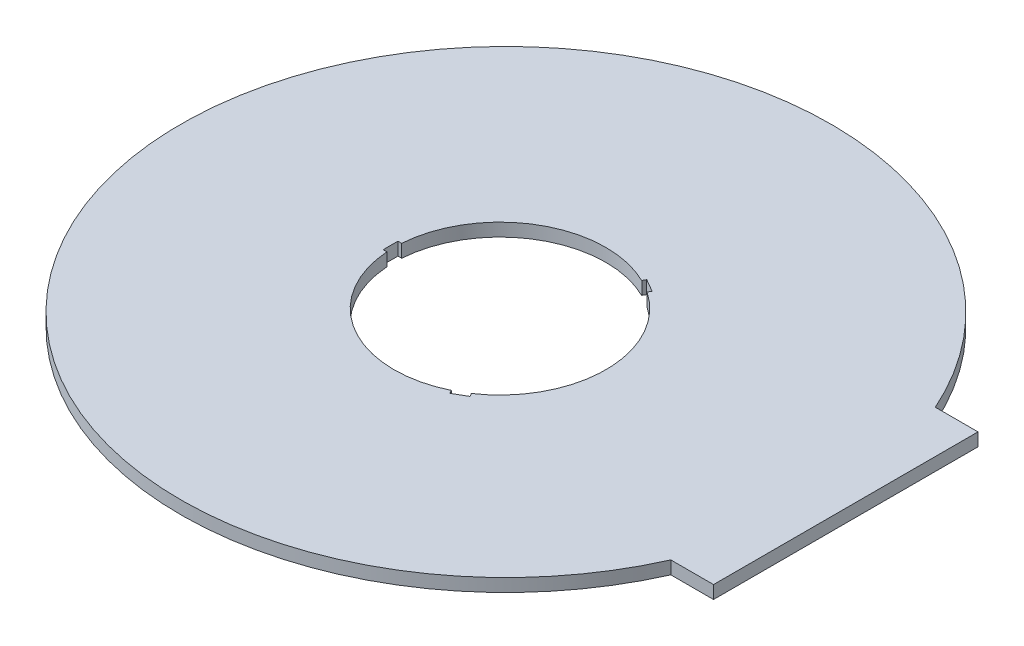
ISO-10303-21;
HEADER;
FILE_DESCRIPTION(('STEP AP214'),'2;1');
FILE_NAME('part.step','',(''),(''),'','','');
FILE_SCHEMA(('AUTOMOTIVE_DESIGN { 1 0 10303 214 1 1 1 1 }'));
ENDSEC;
DATA;
#1=APPLICATION_CONTEXT('core data for automotive mechanical design processes');
#2=APPLICATION_PROTOCOL_DEFINITION('international standard','automotive_design',2000,#1);
#3=PRODUCT_CONTEXT('',#1,'mechanical');
#4=PRODUCT('Part','Part','',(#3));
#5=PRODUCT_RELATED_PRODUCT_CATEGORY('part','',(#4));
#6=PRODUCT_DEFINITION_FORMATION('','',#4);
#7=PRODUCT_DEFINITION_CONTEXT('part definition',#1,'design');
#8=PRODUCT_DEFINITION('design','',#6,#7);
#9=PRODUCT_DEFINITION_SHAPE('','',#8);
#10=(LENGTH_UNIT() NAMED_UNIT(*) SI_UNIT(.MILLI.,.METRE.));
#11=(NAMED_UNIT(*) PLANE_ANGLE_UNIT() SI_UNIT($,.RADIAN.));
#12=(NAMED_UNIT(*) SI_UNIT($,.STERADIAN.) SOLID_ANGLE_UNIT());
#13=UNCERTAINTY_MEASURE_WITH_UNIT(LENGTH_MEASURE(1.E-05),#10,'distance_accuracy_value','');
#14=(GEOMETRIC_REPRESENTATION_CONTEXT(3) GLOBAL_UNCERTAINTY_ASSIGNED_CONTEXT((#13)) GLOBAL_UNIT_ASSIGNED_CONTEXT((#10,
#11,#12)) REPRESENTATION_CONTEXT('',''));
#15=CARTESIAN_POINT('',(0.,0.,0.));
#16=DIRECTION('',(0.,0.,1.));
#17=DIRECTION('',(1.,0.,0.));
#18=AXIS2_PLACEMENT_3D('',#15,#16,#17);
#19=CARTESIAN_POINT('',(-58.6230640228674,173.420204394958,-38.8984302868171));
#20=DIRECTION('',(1.,0.,0.));
#21=DIRECTION('',(0.,0.,-1.));
#22=AXIS2_PLACEMENT_3D('',#19,#20,#21);
#23=PLANE('',#22);
#24=DIRECTION('',(0.,0.,-1.));
#25=VECTOR('',#24,1.);
#26=CARTESIAN_POINT('',(-58.6230640228674,174.999,-38.8984302868171));
#27=LINE('',#26,#25);
#28=CARTESIAN_POINT('',(-58.6230640228674,174.999,-38.8984302868171));
#29=VERTEX_POINT('',#28);
#30=CARTESIAN_POINT('',(-58.6230640228673,174.999,-71.1015697131829));
#31=VERTEX_POINT('',#30);
#32=EDGE_CURVE('E266',#29,#31,#27,.T.);
#33=ORIENTED_EDGE('',*,*,#32,.F.);
#34=DIRECTION('',(0.,1.,0.));
#35=VECTOR('',#34,1.);
#36=CARTESIAN_POINT('',(-58.6230640228674,173.420204394958,-38.8984302868171));
#37=LINE('',#36,#35);
#38=CARTESIAN_POINT('',(-58.6230640228674,173.420204394958,-38.8984302868171));
#39=VERTEX_POINT('',#38);
#40=EDGE_CURVE('E35',#39,#29,#37,.T.);
#41=ORIENTED_EDGE('',*,*,#40,.F.);
#42=DIRECTION('',(0.,0.,-1.));
#43=VECTOR('',#42,1.);
#44=CARTESIAN_POINT('',(-58.6230640228674,173.420204394958,-38.8984302868171));
#45=LINE('',#44,#43);
#46=CARTESIAN_POINT('',(-58.6230640228673,173.420204394958,-71.1015697131829));
#47=VERTEX_POINT('',#46);
#48=EDGE_CURVE('E335',#39,#47,#45,.T.);
#49=ORIENTED_EDGE('',*,*,#48,.T.);
#50=DIRECTION('',(0.,1.,0.));
#51=VECTOR('',#50,1.);
#52=CARTESIAN_POINT('',(-58.6230640228673,173.420204394958,-71.1015697131829));
#53=LINE('',#52,#51);
#54=EDGE_CURVE('E10',#47,#31,#53,.T.);
#55=ORIENTED_EDGE('',*,*,#54,.T.);
#56=EDGE_LOOP('',(#33,#41,#49,#55));
#57=FACE_BOUND('',#56,.T.);
#58=ADVANCED_FACE('F16',(#57),#23,.T.);
#59=CARTESIAN_POINT('',(-58.6230640228673,173.420204394958,-71.1015697131829));
#60=DIRECTION('',(0.,0.,-1.));
#61=DIRECTION('',(-1.,0.,0.));
#62=AXIS2_PLACEMENT_3D('',#59,#60,#61);
#63=PLANE('',#62);
#64=DIRECTION('',(-1.,0.,0.));
#65=VECTOR('',#64,1.);
#66=CARTESIAN_POINT('',(-58.6230640228673,174.999,-71.1015697131829));
#67=LINE('',#66,#65);
#68=CARTESIAN_POINT('',(-63.8122010916743,174.999,-71.1015697131829));
#69=VERTEX_POINT('',#68);
#70=EDGE_CURVE('E269',#31,#69,#67,.T.);
#71=ORIENTED_EDGE('',*,*,#70,.F.);
#72=ORIENTED_EDGE('',*,*,#54,.F.);
#73=DIRECTION('',(-1.,0.,0.));
#74=VECTOR('',#73,1.);
#75=CARTESIAN_POINT('',(-58.6230640228673,173.420204394958,-71.1015697131829));
#76=LINE('',#75,#74);
#77=CARTESIAN_POINT('',(-63.8122010916743,173.420204394958,-71.1015697131829));
#78=VERTEX_POINT('',#77);
#79=EDGE_CURVE('E387',#47,#78,#76,.T.);
#80=ORIENTED_EDGE('',*,*,#79,.T.);
#81=DIRECTION('',(0.,1.,0.));
#82=VECTOR('',#81,1.);
#83=CARTESIAN_POINT('',(-63.8122010916743,173.420204394958,-71.1015697131829));
#84=LINE('',#83,#82);
#85=EDGE_CURVE('E26',#78,#69,#84,.T.);
#86=ORIENTED_EDGE('',*,*,#85,.T.);
#87=EDGE_LOOP('',(#71,#72,#80,#86));
#88=FACE_BOUND('',#87,.T.);
#89=ADVANCED_FACE('F395',(#88),#63,.T.);
#90=CARTESIAN_POINT('',(-64.5422786970172,173.420204394958,-70.));
#91=DIRECTION('',(-0.833549755446666,0.,-0.552444391042938));
#92=DIRECTION('',(-0.552444391042939,0.,0.833549755446666));
#93=AXIS2_PLACEMENT_3D('',#90,#91,#92);
#94=PLANE('',#93);
#95=DIRECTION('',(-0.552444391042939,0.,0.833549755446666));
#96=VECTOR('',#95,1.);
#97=CARTESIAN_POINT('',(-64.5422786970172,174.999,-70.));
#98=LINE('',#97,#96);
#99=CARTESIAN_POINT('',(-63.816607962522,174.999,-71.0949204536792));
#100=VERTEX_POINT('',#99);
#101=EDGE_CURVE('E272',#69,#100,#98,.T.);
#102=ORIENTED_EDGE('',*,*,#101,.F.);
#103=ORIENTED_EDGE('',*,*,#85,.F.);
#104=DIRECTION('',(-0.552444391042939,0.,0.833549755446666));
#105=VECTOR('',#104,1.);
#106=CARTESIAN_POINT('',(-64.5422786970172,173.420204394958,-70.));
#107=LINE('',#106,#105);
#108=CARTESIAN_POINT('',(-63.816607962522,173.420204394958,-71.0949204536792));
#109=VERTEX_POINT('',#108);
#110=EDGE_CURVE('E202',#78,#109,#107,.T.);
#111=ORIENTED_EDGE('',*,*,#110,.T.);
#112=DIRECTION('',(0.,1.,0.));
#113=VECTOR('',#112,1.);
#114=CARTESIAN_POINT('',(-63.816607962522,173.420204394958,-71.0949204536792));
#115=LINE('',#114,#113);
#116=EDGE_CURVE('E194',#109,#100,#115,.T.);
#117=ORIENTED_EDGE('',*,*,#116,.T.);
#118=EDGE_LOOP('',(#102,#103,#111,#117));
#119=FACE_BOUND('',#118,.T.);
#120=ADVANCED_FACE('F391',(#119),#94,.T.);
#121=CARTESIAN_POINT('',(-100.,173.420204394958,-55.));
#122=DIRECTION('',(0.,1.,0.));
#123=DIRECTION('',(0.,0.,1.));
#124=AXIS2_PLACEMENT_3D('',#121,#122,#123);
#125=CYLINDRICAL_SURFACE('',#124,39.6015697131829);
#126=CARTESIAN_POINT('',(-100.,174.999,-55.));
#127=DIRECTION('',(0.,1.,0.));
#128=DIRECTION('',(0.913685803354228,0.,-0.406421274970861));
#129=AXIS2_PLACEMENT_3D('',#126,#127,#128);
#130=CIRCLE('',#129,39.6015697131829);
#131=CARTESIAN_POINT('',(-63.816607962522,174.999,-38.9050795463208));
#132=VERTEX_POINT('',#131);
#133=EDGE_CURVE('E275',#100,#132,#130,.T.);
#134=ORIENTED_EDGE('',*,*,#133,.F.);
#135=ORIENTED_EDGE('',*,*,#116,.F.);
#136=CARTESIAN_POINT('',(-100.,173.420204394958,-55.));
#137=DIRECTION('',(0.,1.,0.));
#138=DIRECTION('',(0.913685803354228,0.,-0.406421274970861));
#139=AXIS2_PLACEMENT_3D('',#136,#137,#138);
#140=CIRCLE('',#139,39.6015697131829);
#141=CARTESIAN_POINT('',(-63.816607962522,173.420204394958,-38.9050795463208));
#142=VERTEX_POINT('',#141);
#143=EDGE_CURVE('E197',#109,#142,#140,.T.);
#144=ORIENTED_EDGE('',*,*,#143,.T.);
#145=DIRECTION('',(0.,1.,0.));
#146=VECTOR('',#145,1.);
#147=CARTESIAN_POINT('',(-63.816607962522,173.420204394958,-38.9050795463208));
#148=LINE('',#147,#146);
#149=EDGE_CURVE('E183',#142,#132,#148,.T.);
#150=ORIENTED_EDGE('',*,*,#149,.T.);
#151=EDGE_LOOP('',(#134,#135,#144,#150));
#152=FACE_BOUND('',#151,.T.);
#153=ADVANCED_FACE('F198',(#152),#125,.T.);
#154=CARTESIAN_POINT('',(-63.8122010916742,173.420204394958,-38.8984302868171));
#155=DIRECTION('',(-0.833549755446656,0.,0.552444391042953));
#156=DIRECTION('',(0.552444391042953,0.,0.833549755446656));
#157=AXIS2_PLACEMENT_3D('',#154,#155,#156);
#158=PLANE('',#157);
#159=DIRECTION('',(0.552444391042953,0.,0.833549755446656));
#160=VECTOR('',#159,1.);
#161=CARTESIAN_POINT('',(-63.8122010916742,174.999,-38.8984302868171));
#162=LINE('',#161,#160);
#163=CARTESIAN_POINT('',(-63.8122010916742,174.999,-38.8984302868171));
#164=VERTEX_POINT('',#163);
#165=EDGE_CURVE('E190',#132,#164,#162,.T.);
#166=ORIENTED_EDGE('',*,*,#165,.F.);
#167=ORIENTED_EDGE('',*,*,#149,.F.);
#168=DIRECTION('',(0.552444391042953,0.,0.833549755446656));
#169=VECTOR('',#168,1.);
#170=CARTESIAN_POINT('',(-63.8122010916742,173.420204394958,-38.8984302868171));
#171=LINE('',#170,#169);
#172=CARTESIAN_POINT('',(-63.8122010916742,173.420204394958,-38.8984302868171));
#173=VERTEX_POINT('',#172);
#174=EDGE_CURVE('E187',#142,#173,#171,.T.);
#175=ORIENTED_EDGE('',*,*,#174,.T.);
#176=DIRECTION('',(0.,1.,0.));
#177=VECTOR('',#176,1.);
#178=CARTESIAN_POINT('',(-63.8122010916742,173.420204394958,-38.8984302868171));
#179=LINE('',#178,#177);
#180=EDGE_CURVE('E111',#173,#164,#179,.T.);
#181=ORIENTED_EDGE('',*,*,#180,.T.);
#182=EDGE_LOOP('',(#166,#167,#175,#181));
#183=FACE_BOUND('',#182,.T.);
#184=ADVANCED_FACE('F185',(#183),#158,.T.);
#185=CARTESIAN_POINT('',(-92.0643796982059,173.420204394958,-43.9999999999989));
#186=DIRECTION('',(-0.188982236504612,0.,0.981980506061966));
#187=DIRECTION('',(0.981980506061966,0.,0.188982236504612));
#188=AXIS2_PLACEMENT_3D('',#185,#186,#187);
#189=PLANE('',#188);
#190=DIRECTION('',(0.981980506061966,0.,0.188982236504612));
#191=VECTOR('',#190,1.);
#192=CARTESIAN_POINT('',(-92.0643796982059,174.999,-43.9999999999989));
#193=LINE('',#192,#191);
#194=CARTESIAN_POINT('',(-93.5444605861132,174.999,-44.2848416996841));
#195=VERTEX_POINT('',#194);
#196=CARTESIAN_POINT('',(-93.4953607316899,174.999,-44.2753924282946));
#197=VERTEX_POINT('',#196);
#198=EDGE_CURVE('E212',#195,#197,#193,.T.);
#199=ORIENTED_EDGE('',*,*,#198,.F.);
#200=DIRECTION('',(0.,1.,0.));
#201=VECTOR('',#200,1.);
#202=CARTESIAN_POINT('',(-93.5444605861132,173.420204394958,-44.2848416996841));
#203=LINE('',#202,#201);
#204=CARTESIAN_POINT('',(-93.5444605861132,173.420204394958,-44.2848416996841));
#205=VERTEX_POINT('',#204);
#206=EDGE_CURVE('E208',#205,#195,#203,.T.);
#207=ORIENTED_EDGE('',*,*,#206,.F.);
#208=DIRECTION('',(0.981980506061966,0.,0.188982236504612));
#209=VECTOR('',#208,1.);
#210=CARTESIAN_POINT('',(-92.0643796982059,173.420204394958,-43.9999999999989));
#211=LINE('',#210,#209);
#212=CARTESIAN_POINT('',(-93.4953607316899,173.420204394958,-44.2753924282946));
#213=VERTEX_POINT('',#212);
#214=EDGE_CURVE('E280',#205,#213,#211,.T.);
#215=ORIENTED_EDGE('',*,*,#214,.T.);
#216=DIRECTION('',(0.,1.,0.));
#217=VECTOR('',#216,1.);
#218=CARTESIAN_POINT('',(-93.4953607316899,173.420204394958,-44.2753924282946));
#219=LINE('',#218,#217);
#220=EDGE_CURVE('E20',#213,#197,#219,.T.);
#221=ORIENTED_EDGE('',*,*,#220,.T.);
#222=EDGE_LOOP('',(#199,#207,#215,#221));
#223=FACE_BOUND('',#222,.T.);
#224=ADVANCED_FACE('F18',(#223),#189,.T.);
#225=CARTESIAN_POINT('',(-93.4953607316899,173.420204394958,-44.2753924282946));
#226=DIRECTION('',(-0.866025403784436,0.,0.500000000000004));
#227=DIRECTION('',(0.500000000000004,0.,0.866025403784436));
#228=AXIS2_PLACEMENT_3D('',#225,#226,#227);
#229=PLANE('',#228);
#230=DIRECTION('',(0.500000000000004,0.,0.866025403784436));
#231=VECTOR('',#230,1.);
#232=CARTESIAN_POINT('',(-93.4953607316899,174.999,-44.2753924282946));
#233=LINE('',#232,#231);
#234=CARTESIAN_POINT('',(-93.2855726407283,174.999,-43.9120287959264));
#235=VERTEX_POINT('',#234);
#236=EDGE_CURVE('E215',#197,#235,#233,.T.);
#237=ORIENTED_EDGE('',*,*,#236,.F.);
#238=ORIENTED_EDGE('',*,*,#220,.F.);
#239=DIRECTION('',(0.500000000000004,0.,0.866025403784436));
#240=VECTOR('',#239,1.);
#241=CARTESIAN_POINT('',(-93.4953607316899,173.420204394958,-44.2753924282946));
#242=LINE('',#241,#240);
#243=CARTESIAN_POINT('',(-93.2855726407283,173.420204394958,-43.9120287959264));
#244=VERTEX_POINT('',#243);
#245=EDGE_CURVE('E339',#213,#244,#242,.T.);
#246=ORIENTED_EDGE('',*,*,#245,.T.);
#247=DIRECTION('',(0.,1.,0.));
#248=VECTOR('',#247,1.);
#249=CARTESIAN_POINT('',(-93.2855726407283,173.420204394958,-43.9120287959264));
#250=LINE('',#249,#248);
#251=EDGE_CURVE('E315',#244,#235,#250,.T.);
#252=ORIENTED_EDGE('',*,*,#251,.T.);
#253=EDGE_LOOP('',(#237,#238,#246,#252));
#254=FACE_BOUND('',#253,.T.);
#255=ADVANCED_FACE('F321',(#254),#229,.T.);
#256=CARTESIAN_POINT('',(-93.2855726407283,173.420204394958,-43.9120287959264));
#257=DIRECTION('',(-0.499999999999994,0.,-0.866025403784442));
#258=DIRECTION('',(-0.866025403784442,0.,0.499999999999994));
#259=AXIS2_PLACEMENT_3D('',#256,#257,#258);
#260=PLANE('',#259);
#261=DIRECTION('',(-0.866025403784442,0.,0.499999999999994));
#262=VECTOR('',#261,1.);
#263=CARTESIAN_POINT('',(-93.2855726407283,174.999,-43.9120287959264));
#264=LINE('',#263,#262);
#265=CARTESIAN_POINT('',(-94.8416995445542,174.999,-43.0135985091093));
#266=VERTEX_POINT('',#265);
#267=EDGE_CURVE('E218',#235,#266,#264,.T.);
#268=ORIENTED_EDGE('',*,*,#267,.F.);
#269=ORIENTED_EDGE('',*,*,#251,.F.);
#270=DIRECTION('',(-0.866025403784442,0.,0.499999999999994));
#271=VECTOR('',#270,1.);
#272=CARTESIAN_POINT('',(-93.2855726407283,173.420204394958,-43.9120287959264));
#273=LINE('',#272,#271);
#274=CARTESIAN_POINT('',(-94.8416995445542,173.420204394958,-43.0135985091093));
#275=VERTEX_POINT('',#274);
#276=EDGE_CURVE('E341',#244,#275,#273,.T.);
#277=ORIENTED_EDGE('',*,*,#276,.T.);
#278=DIRECTION('',(0.,1.,0.));
#279=VECTOR('',#278,1.);
#280=CARTESIAN_POINT('',(-94.8416995445542,173.420204394958,-43.0135985091093));
#281=LINE('',#280,#279);
#282=EDGE_CURVE('E314',#275,#266,#281,.T.);
#283=ORIENTED_EDGE('',*,*,#282,.T.);
#284=EDGE_LOOP('',(#268,#269,#277,#283));
#285=FACE_BOUND('',#284,.T.);
#286=ADVANCED_FACE('F471',(#285),#260,.T.);
#287=CARTESIAN_POINT('',(-94.8416995445542,173.420204394958,-43.0135985091093));
#288=DIRECTION('',(0.866025403784436,0.,-0.500000000000004));
#289=DIRECTION('',(-0.500000000000004,0.,-0.866025403784436));
#290=AXIS2_PLACEMENT_3D('',#287,#288,#289);
#291=PLANE('',#290);
#292=DIRECTION('',(-0.500000000000004,0.,-0.866025403784436));
#293=VECTOR('',#292,1.);
#294=CARTESIAN_POINT('',(-94.8416995445542,174.999,-43.0135985091093));
#295=LINE('',#294,#293);
#296=CARTESIAN_POINT('',(-95.0514876355157,174.999,-43.3769621414775));
#297=VERTEX_POINT('',#296);
#298=EDGE_CURVE('E221',#266,#297,#295,.T.);
#299=ORIENTED_EDGE('',*,*,#298,.F.);
#300=ORIENTED_EDGE('',*,*,#282,.F.);
#301=DIRECTION('',(-0.500000000000004,0.,-0.866025403784436));
#302=VECTOR('',#301,1.);
#303=CARTESIAN_POINT('',(-94.8416995445542,173.420204394958,-43.0135985091093));
#304=LINE('',#303,#302);
#305=CARTESIAN_POINT('',(-95.0514876355157,173.420204394958,-43.3769621414775));
#306=VERTEX_POINT('',#305);
#307=EDGE_CURVE('E346',#275,#306,#304,.T.);
#308=ORIENTED_EDGE('',*,*,#307,.T.);
#309=DIRECTION('',(0.,1.,0.));
#310=VECTOR('',#309,1.);
#311=CARTESIAN_POINT('',(-95.0514876355157,173.420204394958,-43.3769621414775));
#312=LINE('',#311,#310);
#313=EDGE_CURVE('E312',#306,#297,#312,.T.);
#314=ORIENTED_EDGE('',*,*,#313,.T.);
#315=EDGE_LOOP('',(#299,#300,#308,#314));
#316=FACE_BOUND('',#315,.T.);
#317=ADVANCED_FACE('F467',(#316),#291,.T.);
#318=CARTESIAN_POINT('',(-95.5284813133437,173.420204394958,-41.9999999999989));
#319=DIRECTION('',(0.944911182523069,0.,0.327326835353987));
#320=DIRECTION('',(0.327326835353987,0.,-0.944911182523069));
#321=AXIS2_PLACEMENT_3D('',#318,#319,#320);
#322=PLANE('',#321);
#323=DIRECTION('',(0.327326835353987,0.,-0.944911182523068));
#324=VECTOR('',#323,1.);
#325=CARTESIAN_POINT('',(-95.5284813133437,174.999,-41.9999999999989));
#326=LINE('',#325,#324);
#327=CARTESIAN_POINT('',(-95.0351210173746,174.999,-43.424208498425));
#328=VERTEX_POINT('',#327);
#329=EDGE_CURVE('E224',#297,#328,#326,.T.);
#330=ORIENTED_EDGE('',*,*,#329,.F.);
#331=ORIENTED_EDGE('',*,*,#313,.F.);
#332=DIRECTION('',(0.327326835353987,0.,-0.944911182523068));
#333=VECTOR('',#332,1.);
#334=CARTESIAN_POINT('',(-95.5284813133437,173.420204394958,-41.9999999999989));
#335=LINE('',#334,#333);
#336=CARTESIAN_POINT('',(-95.0351210173746,173.420204394958,-43.424208498425));
#337=VERTEX_POINT('',#336);
#338=EDGE_CURVE('E349',#306,#337,#335,.T.);
#339=ORIENTED_EDGE('',*,*,#338,.T.);
#340=DIRECTION('',(0.,1.,0.));
#341=VECTOR('',#340,1.);
#342=CARTESIAN_POINT('',(-95.0351210173746,173.420204394958,-43.424208498425));
#343=LINE('',#342,#341);
#344=EDGE_CURVE('E310',#337,#328,#343,.T.);
#345=ORIENTED_EDGE('',*,*,#344,.T.);
#346=EDGE_LOOP('',(#330,#331,#339,#345));
#347=FACE_BOUND('',#346,.T.);
#348=ADVANCED_FACE('F463',(#347),#322,.T.);
#349=CARTESIAN_POINT('',(-100.72463373605,173.420204394958,-54.9999999999988));
#350=DIRECTION('',(0.,1.,0.));
#351=DIRECTION('',(0.,0.,1.));
#352=AXIS2_PLACEMENT_3D('',#349,#350,#351);
#353=CYLINDRICAL_SURFACE('',#352,12.8984302868171);
#354=CARTESIAN_POINT('',(-100.72463373605,174.999,-54.9999999999988));
#355=DIRECTION('',(0.,-1.,0.));
#356=DIRECTION('',(0.441101172170597,0.,0.897457383896152));
#357=AXIS2_PLACEMENT_3D('',#354,#355,#356);
#358=CIRCLE('',#357,12.8984302868171);
#359=CARTESIAN_POINT('',(-113.594319604663,174.999,-54.1393667987398));
#360=VERTEX_POINT('',#359);
#361=EDGE_CURVE('E227',#328,#360,#358,.T.);
#362=ORIENTED_EDGE('',*,*,#361,.F.);
#363=ORIENTED_EDGE('',*,*,#344,.F.);
#364=CARTESIAN_POINT('',(-100.72463373605,173.420204394958,-54.9999999999988));
#365=DIRECTION('',(0.,-1.,0.));
#366=DIRECTION('',(0.441101172170597,0.,0.897457383896152));
#367=AXIS2_PLACEMENT_3D('',#364,#365,#366);
#368=CIRCLE('',#367,12.8984302868171);
#369=CARTESIAN_POINT('',(-113.594319604663,173.420204394958,-54.1393667987398));
#370=VERTEX_POINT('',#369);
#371=EDGE_CURVE('E352',#337,#370,#368,.T.);
#372=ORIENTED_EDGE('',*,*,#371,.T.);
#373=DIRECTION('',(0.,1.,0.));
#374=VECTOR('',#373,1.);
#375=CARTESIAN_POINT('',(-113.594319604663,173.420204394958,-54.1393667987398));
#376=LINE('',#375,#374);
#377=EDGE_CURVE('E308',#370,#360,#376,.T.);
#378=ORIENTED_EDGE('',*,*,#377,.T.);
#379=EDGE_LOOP('',(#362,#363,#372,#378));
#380=FACE_BOUND('',#379,.T.);
#381=ADVANCED_FACE('F459',(#380),#353,.F.);
#382=CARTESIAN_POINT('',(-114.581040196601,173.420204394958,-52.9999999999988));
#383=DIRECTION('',(-0.755928946018453,0.,-0.654653670707979));
#384=DIRECTION('',(-0.654653670707979,0.,0.755928946018453));
#385=AXIS2_PLACEMENT_3D('',#382,#383,#384);
#386=PLANE('',#385);
#387=DIRECTION('',(-0.654653670707979,0.,0.755928946018453));
#388=VECTOR('',#387,1.);
#389=CARTESIAN_POINT('',(-114.581040196601,174.999,-52.9999999999988));
#390=LINE('',#389,#388);
#391=CARTESIAN_POINT('',(-113.627052840945,174.999,-54.1015697131817));
#392=VERTEX_POINT('',#391);
#393=EDGE_CURVE('E230',#360,#392,#390,.T.);
#394=ORIENTED_EDGE('',*,*,#393,.F.);
#395=ORIENTED_EDGE('',*,*,#377,.F.);
#396=DIRECTION('',(-0.654653670707979,0.,0.755928946018453));
#397=VECTOR('',#396,1.);
#398=CARTESIAN_POINT('',(-114.581040196601,173.420204394958,-52.9999999999988));
#399=LINE('',#398,#397);
#400=CARTESIAN_POINT('',(-113.627052840945,173.420204394958,-54.1015697131817));
#401=VERTEX_POINT('',#400);
#402=EDGE_CURVE('E355',#370,#401,#399,.T.);
#403=ORIENTED_EDGE('',*,*,#402,.T.);
#404=DIRECTION('',(0.,1.,0.));
#405=VECTOR('',#404,1.);
#406=CARTESIAN_POINT('',(-113.627052840945,173.420204394958,-54.1015697131817));
#407=LINE('',#406,#405);
#408=EDGE_CURVE('E306',#401,#392,#407,.T.);
#409=ORIENTED_EDGE('',*,*,#408,.T.);
#410=EDGE_LOOP('',(#394,#395,#403,#409));
#411=FACE_BOUND('',#410,.T.);
#412=ADVANCED_FACE('F455',(#411),#386,.T.);
#413=CARTESIAN_POINT('',(-113.627052840945,173.420204394958,-54.1015697131817));
#414=DIRECTION('',(0.,0.,-1.));
#415=DIRECTION('',(-1.,0.,0.));
#416=AXIS2_PLACEMENT_3D('',#413,#414,#415);
#417=PLANE('',#416);
#418=DIRECTION('',(-1.,0.,0.));
#419=VECTOR('',#418,1.);
#420=CARTESIAN_POINT('',(-113.627052840945,174.999,-54.1015697131817));
#421=LINE('',#420,#419);
#422=CARTESIAN_POINT('',(-114.046629022869,174.999,-54.1015697131817));
#423=VERTEX_POINT('',#422);
#424=EDGE_CURVE('E233',#392,#423,#421,.T.);
#425=ORIENTED_EDGE('',*,*,#424,.F.);
#426=ORIENTED_EDGE('',*,*,#408,.F.);
#427=DIRECTION('',(-1.,0.,0.));
#428=VECTOR('',#427,1.);
#429=CARTESIAN_POINT('',(-113.627052840945,173.420204394958,-54.1015697131817));
#430=LINE('',#429,#428);
#431=CARTESIAN_POINT('',(-114.046629022869,173.420204394958,-54.1015697131817));
#432=VERTEX_POINT('',#431);
#433=EDGE_CURVE('E358',#401,#432,#430,.T.);
#434=ORIENTED_EDGE('',*,*,#433,.T.);
#435=DIRECTION('',(0.,1.,0.));
#436=VECTOR('',#435,1.);
#437=CARTESIAN_POINT('',(-114.046629022869,173.420204394958,-54.1015697131817));
#438=LINE('',#437,#436);
#439=EDGE_CURVE('E304',#432,#423,#438,.T.);
#440=ORIENTED_EDGE('',*,*,#439,.T.);
#441=EDGE_LOOP('',(#425,#426,#434,#440));
#442=FACE_BOUND('',#441,.T.);
#443=ADVANCED_FACE('F451',(#442),#417,.T.);
#444=CARTESIAN_POINT('',(-114.046629022869,173.420204394958,-54.1015697131817));
#445=DIRECTION('',(1.,0.,0.));
#446=DIRECTION('',(0.,0.,-1.));
#447=AXIS2_PLACEMENT_3D('',#444,#445,#446);
#448=PLANE('',#447);
#449=DIRECTION('',(0.,0.,-1.));
#450=VECTOR('',#449,1.);
#451=CARTESIAN_POINT('',(-114.046629022869,174.999,-54.1015697131817));
#452=LINE('',#451,#450);
#453=CARTESIAN_POINT('',(-114.046629022869,174.999,-55.8984302868158));
#454=VERTEX_POINT('',#453);
#455=EDGE_CURVE('E236',#423,#454,#452,.T.);
#456=ORIENTED_EDGE('',*,*,#455,.F.);
#457=ORIENTED_EDGE('',*,*,#439,.F.);
#458=DIRECTION('',(0.,0.,-1.));
#459=VECTOR('',#458,1.);
#460=CARTESIAN_POINT('',(-114.046629022869,173.420204394958,-54.1015697131817));
#461=LINE('',#460,#459);
#462=CARTESIAN_POINT('',(-114.046629022869,173.420204394958,-55.8984302868158));
#463=VERTEX_POINT('',#462);
#464=EDGE_CURVE('E361',#432,#463,#461,.T.);
#465=ORIENTED_EDGE('',*,*,#464,.T.);
#466=DIRECTION('',(0.,1.,0.));
#467=VECTOR('',#466,1.);
#468=CARTESIAN_POINT('',(-114.046629022869,173.420204394958,-55.8984302868158));
#469=LINE('',#468,#467);
#470=EDGE_CURVE('E302',#463,#454,#469,.T.);
#471=ORIENTED_EDGE('',*,*,#470,.T.);
#472=EDGE_LOOP('',(#456,#457,#465,#471));
#473=FACE_BOUND('',#472,.T.);
#474=ADVANCED_FACE('F447',(#473),#448,.T.);
#475=CARTESIAN_POINT('',(-114.046629022869,173.420204394958,-55.8984302868158));
#476=DIRECTION('',(0.,0.,1.));
#477=DIRECTION('',(1.,0.,0.));
#478=AXIS2_PLACEMENT_3D('',#475,#476,#477);
#479=PLANE('',#478);
#480=DIRECTION('',(1.,0.,0.));
#481=VECTOR('',#480,1.);
#482=CARTESIAN_POINT('',(-114.046629022869,174.999,-55.8984302868158));
#483=LINE('',#482,#481);
#484=CARTESIAN_POINT('',(-113.627052840945,174.999,-55.8984302868158));
#485=VERTEX_POINT('',#484);
#486=EDGE_CURVE('E239',#454,#485,#483,.T.);
#487=ORIENTED_EDGE('',*,*,#486,.F.);
#488=ORIENTED_EDGE('',*,*,#470,.F.);
#489=DIRECTION('',(1.,0.,0.));
#490=VECTOR('',#489,1.);
#491=CARTESIAN_POINT('',(-114.046629022869,173.420204394958,-55.8984302868158));
#492=LINE('',#491,#490);
#493=CARTESIAN_POINT('',(-113.627052840945,173.420204394958,-55.8984302868158));
#494=VERTEX_POINT('',#493);
#495=EDGE_CURVE('E364',#463,#494,#492,.T.);
#496=ORIENTED_EDGE('',*,*,#495,.T.);
#497=DIRECTION('',(0.,1.,0.));
#498=VECTOR('',#497,1.);
#499=CARTESIAN_POINT('',(-113.627052840945,173.420204394958,-55.8984302868158));
#500=LINE('',#499,#498);
#501=EDGE_CURVE('E300',#494,#485,#500,.T.);
#502=ORIENTED_EDGE('',*,*,#501,.T.);
#503=EDGE_LOOP('',(#487,#488,#496,#502));
#504=FACE_BOUND('',#503,.T.);
#505=ADVANCED_FACE('F443',(#504),#479,.T.);
#506=CARTESIAN_POINT('',(-114.581040196601,173.420204394958,-56.9999999999988));
#507=DIRECTION('',(-0.755928946018455,0.,0.654653670707977));
#508=DIRECTION('',(0.654653670707977,0.,0.755928946018455));
#509=AXIS2_PLACEMENT_3D('',#506,#507,#508);
#510=PLANE('',#509);
#511=DIRECTION('',(0.654653670707977,0.,0.755928946018455));
#512=VECTOR('',#511,1.);
#513=CARTESIAN_POINT('',(-114.581040196601,174.999,-56.9999999999988));
#514=LINE('',#513,#512);
#515=CARTESIAN_POINT('',(-113.594319604663,174.999,-55.8606332012577));
#516=VERTEX_POINT('',#515);
#517=EDGE_CURVE('E242',#485,#516,#514,.T.);
#518=ORIENTED_EDGE('',*,*,#517,.F.);
#519=ORIENTED_EDGE('',*,*,#501,.F.);
#520=DIRECTION('',(0.654653670707977,0.,0.755928946018455));
#521=VECTOR('',#520,1.);
#522=CARTESIAN_POINT('',(-114.581040196601,173.420204394958,-56.9999999999988));
#523=LINE('',#522,#521);
#524=CARTESIAN_POINT('',(-113.594319604663,173.420204394958,-55.8606332012577));
#525=VERTEX_POINT('',#524);
#526=EDGE_CURVE('E367',#494,#525,#523,.T.);
#527=ORIENTED_EDGE('',*,*,#526,.T.);
#528=DIRECTION('',(0.,1.,0.));
#529=VECTOR('',#528,1.);
#530=CARTESIAN_POINT('',(-113.594319604663,173.420204394958,-55.8606332012577));
#531=LINE('',#530,#529);
#532=EDGE_CURVE('E298',#525,#516,#531,.T.);
#533=ORIENTED_EDGE('',*,*,#532,.T.);
#534=EDGE_LOOP('',(#518,#519,#527,#533));
#535=FACE_BOUND('',#534,.T.);
#536=ADVANCED_FACE('F439',(#535),#510,.T.);
#537=CARTESIAN_POINT('',(-100.72463373605,173.420204394958,-54.9999999999988));
#538=DIRECTION('',(0.,1.,0.));
#539=DIRECTION('',(0.,0.,1.));
#540=AXIS2_PLACEMENT_3D('',#537,#538,#539);
#541=CYLINDRICAL_SURFACE('',#540,12.8984302868171);
#542=CARTESIAN_POINT('',(-100.72463373605,174.999,-54.9999999999988));
#543=DIRECTION('',(0.,-1.,0.));
#544=DIRECTION('',(-0.99777147935329,0.,-0.066723871209242));
#545=AXIS2_PLACEMENT_3D('',#542,#543,#544);
#546=CIRCLE('',#545,12.8984302868171);
#547=CARTESIAN_POINT('',(-95.0351210173746,174.999,-66.5757915015725));
#548=VERTEX_POINT('',#547);
#549=EDGE_CURVE('E245',#516,#548,#546,.T.);
#550=ORIENTED_EDGE('',*,*,#549,.F.);
#551=ORIENTED_EDGE('',*,*,#532,.F.);
#552=CARTESIAN_POINT('',(-100.72463373605,173.420204394958,-54.9999999999988));
#553=DIRECTION('',(0.,-1.,0.));
#554=DIRECTION('',(-0.99777147935329,0.,-0.066723871209242));
#555=AXIS2_PLACEMENT_3D('',#552,#553,#554);
#556=CIRCLE('',#555,12.8984302868171);
#557=CARTESIAN_POINT('',(-95.0351210173746,173.420204394958,-66.5757915015725));
#558=VERTEX_POINT('',#557);
#559=EDGE_CURVE('E370',#525,#558,#556,.T.);
#560=ORIENTED_EDGE('',*,*,#559,.T.);
#561=DIRECTION('',(0.,1.,0.));
#562=VECTOR('',#561,1.);
#563=CARTESIAN_POINT('',(-95.0351210173746,173.420204394958,-66.5757915015725));
#564=LINE('',#563,#562);
#565=EDGE_CURVE('E296',#558,#548,#564,.T.);
#566=ORIENTED_EDGE('',*,*,#565,.T.);
#567=EDGE_LOOP('',(#550,#551,#560,#566));
#568=FACE_BOUND('',#567,.T.);
#569=ADVANCED_FACE('F435',(#568),#541,.F.);
#570=CARTESIAN_POINT('',(-95.5284813133438,173.420204394958,-67.9999999999988));
#571=DIRECTION('',(0.944911182523064,0.,-0.327326835354));
#572=DIRECTION('',(-0.327326835354,0.,-0.944911182523064));
#573=AXIS2_PLACEMENT_3D('',#570,#571,#572);
#574=PLANE('',#573);
#575=DIRECTION('',(-0.327326835354,0.,-0.944911182523064));
#576=VECTOR('',#575,1.);
#577=CARTESIAN_POINT('',(-95.5284813133438,174.999,-67.9999999999988));
#578=LINE('',#577,#576);
#579=CARTESIAN_POINT('',(-95.0514876355158,174.999,-66.6230378585201));
#580=VERTEX_POINT('',#579);
#581=EDGE_CURVE('E248',#548,#580,#578,.T.);
#582=ORIENTED_EDGE('',*,*,#581,.F.);
#583=ORIENTED_EDGE('',*,*,#565,.F.);
#584=DIRECTION('',(-0.327326835354,0.,-0.944911182523064));
#585=VECTOR('',#584,1.);
#586=CARTESIAN_POINT('',(-95.5284813133438,173.420204394958,-67.9999999999988));
#587=LINE('',#586,#585);
#588=CARTESIAN_POINT('',(-95.0514876355158,173.420204394958,-66.6230378585201));
#589=VERTEX_POINT('',#588);
#590=EDGE_CURVE('E373',#558,#589,#587,.T.);
#591=ORIENTED_EDGE('',*,*,#590,.T.);
#592=DIRECTION('',(0.,1.,0.));
#593=VECTOR('',#592,1.);
#594=CARTESIAN_POINT('',(-95.0514876355158,173.420204394958,-66.6230378585201));
#595=LINE('',#594,#593);
#596=EDGE_CURVE('E294',#589,#580,#595,.T.);
#597=ORIENTED_EDGE('',*,*,#596,.T.);
#598=EDGE_LOOP('',(#582,#583,#591,#597));
#599=FACE_BOUND('',#598,.T.);
#600=ADVANCED_FACE('F431',(#599),#574,.T.);
#601=CARTESIAN_POINT('',(-95.0514876355158,173.420204394958,-66.6230378585201));
#602=DIRECTION('',(0.866025403784443,0.,0.499999999999992));
#603=DIRECTION('',(0.499999999999992,0.,-0.866025403784443));
#604=AXIS2_PLACEMENT_3D('',#601,#602,#603);
#605=PLANE('',#604);
#606=DIRECTION('',(0.499999999999992,0.,-0.866025403784443));
#607=VECTOR('',#606,1.);
#608=CARTESIAN_POINT('',(-95.0514876355158,174.999,-66.6230378585201));
#609=LINE('',#608,#607);
#610=CARTESIAN_POINT('',(-94.841699544554,174.999,-66.9864014908888));
#611=VERTEX_POINT('',#610);
#612=EDGE_CURVE('E251',#580,#611,#609,.T.);
#613=ORIENTED_EDGE('',*,*,#612,.F.);
#614=ORIENTED_EDGE('',*,*,#596,.F.);
#615=DIRECTION('',(0.499999999999992,0.,-0.866025403784443));
#616=VECTOR('',#615,1.);
#617=CARTESIAN_POINT('',(-95.0514876355158,173.420204394958,-66.6230378585201));
#618=LINE('',#617,#616);
#619=CARTESIAN_POINT('',(-94.841699544554,173.420204394958,-66.9864014908888));
#620=VERTEX_POINT('',#619);
#621=EDGE_CURVE('E376',#589,#620,#618,.T.);
#622=ORIENTED_EDGE('',*,*,#621,.T.);
#623=DIRECTION('',(0.,1.,0.));
#624=VECTOR('',#623,1.);
#625=CARTESIAN_POINT('',(-94.841699544554,173.420204394958,-66.9864014908888));
#626=LINE('',#625,#624);
#627=EDGE_CURVE('E292',#620,#611,#626,.T.);
#628=ORIENTED_EDGE('',*,*,#627,.T.);
#629=EDGE_LOOP('',(#613,#614,#622,#628));
#630=FACE_BOUND('',#629,.T.);
#631=ADVANCED_FACE('F427',(#630),#605,.T.);
#632=CARTESIAN_POINT('',(-94.841699544554,173.420204394958,-66.9864014908888));
#633=DIRECTION('',(-0.500000000000002,0.,0.866025403784437));
#634=DIRECTION('',(0.866025403784437,0.,0.500000000000002));
#635=AXIS2_PLACEMENT_3D('',#632,#633,#634);
#636=PLANE('',#635);
#637=DIRECTION('',(0.866025403784437,0.,0.500000000000002));
#638=VECTOR('',#637,1.);
#639=CARTESIAN_POINT('',(-94.841699544554,174.999,-66.9864014908888));
#640=LINE('',#639,#638);
#641=CARTESIAN_POINT('',(-93.2855726407283,174.999,-66.0879712040717));
#642=VERTEX_POINT('',#641);
#643=EDGE_CURVE('E254',#611,#642,#640,.T.);
#644=ORIENTED_EDGE('',*,*,#643,.F.);
#645=ORIENTED_EDGE('',*,*,#627,.F.);
#646=DIRECTION('',(0.866025403784437,0.,0.500000000000002));
#647=VECTOR('',#646,1.);
#648=CARTESIAN_POINT('',(-94.841699544554,173.420204394958,-66.9864014908888));
#649=LINE('',#648,#647);
#650=CARTESIAN_POINT('',(-93.2855726407283,173.420204394958,-66.0879712040717));
#651=VERTEX_POINT('',#650);
#652=EDGE_CURVE('E379',#620,#651,#649,.T.);
#653=ORIENTED_EDGE('',*,*,#652,.T.);
#654=DIRECTION('',(0.,1.,0.));
#655=VECTOR('',#654,1.);
#656=CARTESIAN_POINT('',(-93.2855726407283,173.420204394958,-66.0879712040717));
#657=LINE('',#656,#655);
#658=EDGE_CURVE('E290',#651,#642,#657,.T.);
#659=ORIENTED_EDGE('',*,*,#658,.T.);
#660=EDGE_LOOP('',(#644,#645,#653,#659));
#661=FACE_BOUND('',#660,.T.);
#662=ADVANCED_FACE('F423',(#661),#636,.T.);
#663=CARTESIAN_POINT('',(-93.2855726407283,173.420204394958,-66.0879712040717));
#664=DIRECTION('',(-0.866025403784443,0.,-0.499999999999992));
#665=DIRECTION('',(-0.499999999999992,0.,0.866025403784443));
#666=AXIS2_PLACEMENT_3D('',#663,#664,#665);
#667=PLANE('',#666);
#668=DIRECTION('',(-0.499999999999992,0.,0.866025403784443));
#669=VECTOR('',#668,1.);
#670=CARTESIAN_POINT('',(-93.2855726407283,174.999,-66.0879712040717));
#671=LINE('',#670,#669);
#672=CARTESIAN_POINT('',(-93.49536073169,174.999,-65.7246075717031));
#673=VERTEX_POINT('',#672);
#674=EDGE_CURVE('E257',#642,#673,#671,.T.);
#675=ORIENTED_EDGE('',*,*,#674,.F.);
#676=ORIENTED_EDGE('',*,*,#658,.F.);
#677=DIRECTION('',(-0.499999999999992,0.,0.866025403784443));
#678=VECTOR('',#677,1.);
#679=CARTESIAN_POINT('',(-93.2855726407283,173.420204394958,-66.0879712040717));
#680=LINE('',#679,#678);
#681=CARTESIAN_POINT('',(-93.49536073169,173.420204394958,-65.7246075717031));
#682=VERTEX_POINT('',#681);
#683=EDGE_CURVE('E382',#651,#682,#680,.T.);
#684=ORIENTED_EDGE('',*,*,#683,.T.);
#685=DIRECTION('',(0.,1.,0.));
#686=VECTOR('',#685,1.);
#687=CARTESIAN_POINT('',(-93.49536073169,173.420204394958,-65.7246075717031));
#688=LINE('',#687,#686);
#689=EDGE_CURVE('E288',#682,#673,#688,.T.);
#690=ORIENTED_EDGE('',*,*,#689,.T.);
#691=EDGE_LOOP('',(#675,#676,#684,#690));
#692=FACE_BOUND('',#691,.T.);
#693=ADVANCED_FACE('F419',(#692),#667,.T.);
#694=CARTESIAN_POINT('',(-92.064379698206,173.420204394958,-65.9999999999988));
#695=DIRECTION('',(-0.188982236504617,0.,-0.981980506061965));
#696=DIRECTION('',(-0.981980506061965,0.,0.188982236504617));
#697=AXIS2_PLACEMENT_3D('',#694,#695,#696);
#698=PLANE('',#697);
#699=DIRECTION('',(-0.981980506061965,0.,0.188982236504617));
#700=VECTOR('',#699,1.);
#701=CARTESIAN_POINT('',(-92.064379698206,174.999,-65.9999999999988));
#702=LINE('',#701,#700);
#703=CARTESIAN_POINT('',(-93.5444605861135,174.999,-65.7151583003136));
#704=VERTEX_POINT('',#703);
#705=EDGE_CURVE('E260',#673,#704,#702,.T.);
#706=ORIENTED_EDGE('',*,*,#705,.F.);
#707=ORIENTED_EDGE('',*,*,#689,.F.);
#708=DIRECTION('',(-0.981980506061965,0.,0.188982236504617));
#709=VECTOR('',#708,1.);
#710=CARTESIAN_POINT('',(-92.064379698206,173.420204394958,-65.9999999999988));
#711=LINE('',#710,#709);
#712=CARTESIAN_POINT('',(-93.5444605861135,173.420204394958,-65.7151583003136));
#713=VERTEX_POINT('',#712);
#714=EDGE_CURVE('E336',#682,#713,#711,.T.);
#715=ORIENTED_EDGE('',*,*,#714,.T.);
#716=DIRECTION('',(0.,1.,0.));
#717=VECTOR('',#716,1.);
#718=CARTESIAN_POINT('',(-93.5444605861135,173.420204394958,-65.7151583003136));
#719=LINE('',#718,#717);
#720=EDGE_CURVE('E286',#713,#704,#719,.T.);
#721=ORIENTED_EDGE('',*,*,#720,.T.);
#722=EDGE_LOOP('',(#706,#707,#715,#721));
#723=FACE_BOUND('',#722,.T.);
#724=ADVANCED_FACE('F405',(#723),#698,.T.);
#725=CARTESIAN_POINT('',(-100.72463373605,173.420204394958,-54.9999999999988));
#726=DIRECTION('',(0.,1.,0.));
#727=DIRECTION('',(0.,0.,1.));
#728=AXIS2_PLACEMENT_3D('',#725,#726,#727);
#729=CYLINDRICAL_SURFACE('',#728,12.8984302868171);
#730=CARTESIAN_POINT('',(-100.72463373605,174.999,-54.9999999999988));
#731=DIRECTION('',(0.,-1.,0.));
#732=DIRECTION('',(0.556670307182681,0.,-0.830733512686914));
#733=AXIS2_PLACEMENT_3D('',#730,#731,#732);
#734=CIRCLE('',#733,12.8984302868171);
#735=EDGE_CURVE('E263',#704,#195,#734,.T.);
#736=ORIENTED_EDGE('',*,*,#735,.F.);
#737=ORIENTED_EDGE('',*,*,#720,.F.);
#738=CARTESIAN_POINT('',(-100.72463373605,173.420204394958,-54.9999999999988));
#739=DIRECTION('',(0.,-1.,0.));
#740=DIRECTION('',(0.556670307182681,0.,-0.830733512686914));
#741=AXIS2_PLACEMENT_3D('',#738,#739,#740);
#742=CIRCLE('',#741,12.8984302868171);
#743=EDGE_CURVE('E332',#713,#205,#742,.T.);
#744=ORIENTED_EDGE('',*,*,#743,.T.);
#745=ORIENTED_EDGE('',*,*,#206,.T.);
#746=EDGE_LOOP('',(#736,#737,#744,#745));
#747=FACE_BOUND('',#746,.T.);
#748=ADVANCED_FACE('F328',(#747),#729,.F.);
#749=CARTESIAN_POINT('',(-63.8122010916742,173.420204394958,-38.8984302868171));
#750=DIRECTION('',(0.,0.,1.));
#751=DIRECTION('',(1.,0.,0.));
#752=AXIS2_PLACEMENT_3D('',#749,#750,#751);
#753=PLANE('',#752);
#754=DIRECTION('',(1.,0.,0.));
#755=VECTOR('',#754,1.);
#756=CARTESIAN_POINT('',(-63.8122010916742,174.999,-38.8984302868171));
#757=LINE('',#756,#755);
#758=EDGE_CURVE('E278',#164,#29,#757,.T.);
#759=ORIENTED_EDGE('',*,*,#758,.F.);
#760=ORIENTED_EDGE('',*,*,#180,.F.);
#761=DIRECTION('',(1.,0.,0.));
#762=VECTOR('',#761,1.);
#763=CARTESIAN_POINT('',(-63.8122010916742,173.420204394958,-38.8984302868171));
#764=LINE('',#763,#762);
#765=EDGE_CURVE('E206',#173,#39,#764,.T.);
#766=ORIENTED_EDGE('',*,*,#765,.T.);
#767=ORIENTED_EDGE('',*,*,#40,.T.);
#768=EDGE_LOOP('',(#759,#760,#766,#767));
#769=FACE_BOUND('',#768,.T.);
#770=ADVANCED_FACE('F396',(#769),#753,.T.);
#771=CARTESIAN_POINT('',(-138.5,173.420204394958,-55.));
#772=DIRECTION('',(0.,1.,0.));
#773=DIRECTION('',(-1.,0.,0.));
#774=AXIS2_PLACEMENT_3D('',#771,#772,#773);
#775=PLANE('',#774);
#776=ORIENTED_EDGE('',*,*,#214,.F.);
#777=ORIENTED_EDGE('',*,*,#743,.F.);
#778=ORIENTED_EDGE('',*,*,#714,.F.);
#779=ORIENTED_EDGE('',*,*,#683,.F.);
#780=ORIENTED_EDGE('',*,*,#652,.F.);
#781=ORIENTED_EDGE('',*,*,#621,.F.);
#782=ORIENTED_EDGE('',*,*,#590,.F.);
#783=ORIENTED_EDGE('',*,*,#559,.F.);
#784=ORIENTED_EDGE('',*,*,#526,.F.);
#785=ORIENTED_EDGE('',*,*,#495,.F.);
#786=ORIENTED_EDGE('',*,*,#464,.F.);
#787=ORIENTED_EDGE('',*,*,#433,.F.);
#788=ORIENTED_EDGE('',*,*,#402,.F.);
#789=ORIENTED_EDGE('',*,*,#371,.F.);
#790=ORIENTED_EDGE('',*,*,#338,.F.);
#791=ORIENTED_EDGE('',*,*,#307,.F.);
#792=ORIENTED_EDGE('',*,*,#276,.F.);
#793=ORIENTED_EDGE('',*,*,#245,.F.);
#794=EDGE_LOOP('',(#776,#777,#778,#779,#780,#781,#782,#783,#784,#785,#786,#787,#788,#789,#790,
#791,#792,#793));
#795=FACE_BOUND('',#794,.T.);
#796=ORIENTED_EDGE('',*,*,#48,.F.);
#797=ORIENTED_EDGE('',*,*,#765,.F.);
#798=ORIENTED_EDGE('',*,*,#174,.F.);
#799=ORIENTED_EDGE('',*,*,#143,.F.);
#800=ORIENTED_EDGE('',*,*,#110,.F.);
#801=ORIENTED_EDGE('',*,*,#79,.F.);
#802=EDGE_LOOP('',(#796,#797,#798,#799,#800,#801));
#803=FACE_BOUND('',#802,.T.);
#804=ADVANCED_FACE('F205',(#795,#803),#775,.F.);
#805=CARTESIAN_POINT('',(-138.5,174.999,-55.));
#806=DIRECTION('',(0.,1.,0.));
#807=DIRECTION('',(-1.,0.,0.));
#808=AXIS2_PLACEMENT_3D('',#805,#806,#807);
#809=PLANE('',#808);
#810=ORIENTED_EDGE('',*,*,#198,.T.);
#811=ORIENTED_EDGE('',*,*,#236,.T.);
#812=ORIENTED_EDGE('',*,*,#267,.T.);
#813=ORIENTED_EDGE('',*,*,#298,.T.);
#814=ORIENTED_EDGE('',*,*,#329,.T.);
#815=ORIENTED_EDGE('',*,*,#361,.T.);
#816=ORIENTED_EDGE('',*,*,#393,.T.);
#817=ORIENTED_EDGE('',*,*,#424,.T.);
#818=ORIENTED_EDGE('',*,*,#455,.T.);
#819=ORIENTED_EDGE('',*,*,#486,.T.);
#820=ORIENTED_EDGE('',*,*,#517,.T.);
#821=ORIENTED_EDGE('',*,*,#549,.T.);
#822=ORIENTED_EDGE('',*,*,#581,.T.);
#823=ORIENTED_EDGE('',*,*,#612,.T.);
#824=ORIENTED_EDGE('',*,*,#643,.T.);
#825=ORIENTED_EDGE('',*,*,#674,.T.);
#826=ORIENTED_EDGE('',*,*,#705,.T.);
#827=ORIENTED_EDGE('',*,*,#735,.T.);
#828=EDGE_LOOP('',(#810,#811,#812,#813,#814,#815,#816,#817,#818,#819,#820,#821,#822,#823,#824,
#825,#826,#827));
#829=FACE_BOUND('',#828,.T.);
#830=ORIENTED_EDGE('',*,*,#32,.T.);
#831=ORIENTED_EDGE('',*,*,#70,.T.);
#832=ORIENTED_EDGE('',*,*,#101,.T.);
#833=ORIENTED_EDGE('',*,*,#133,.T.);
#834=ORIENTED_EDGE('',*,*,#165,.T.);
#835=ORIENTED_EDGE('',*,*,#758,.T.);
#836=EDGE_LOOP('',(#830,#831,#832,#833,#834,#835));
#837=FACE_BOUND('',#836,.T.);
#838=ADVANCED_FACE('F323',(#829,#837),#809,.T.);
#839=CLOSED_SHELL('',(#58,#89,#120,#153,#184,#224,#255,#286,#317,#348,#381,#412,#443,#474,#505,
#536,#569,#600,#631,#662,#693,#724,#748,#770,#804,#838));
#840=MANIFOLD_SOLID_BREP('B1',#839);
#841=ADVANCED_BREP_SHAPE_REPRESENTATION('',(#18,#840),#14);
#842=SHAPE_DEFINITION_REPRESENTATION(#9,#841);
ENDSEC;
END-ISO-10303-21;
